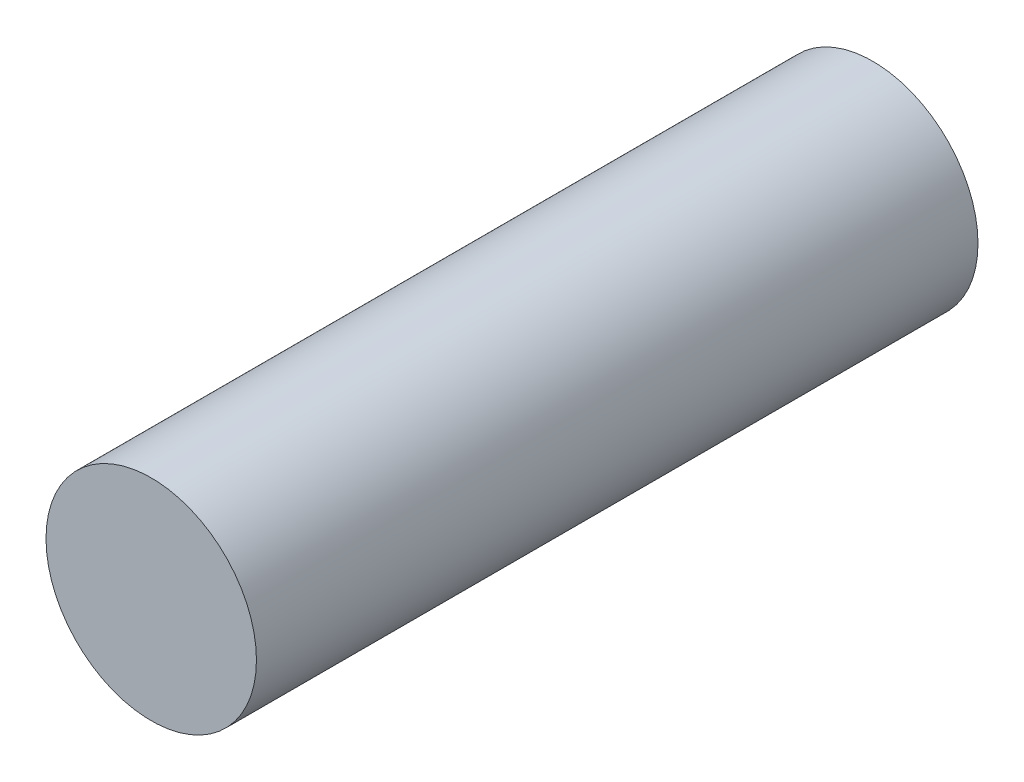
ISO-10303-21;
HEADER;
FILE_DESCRIPTION(('STEP AP214'),'2;1');
FILE_NAME('part.step','',(''),(''),'','','');
FILE_SCHEMA(('AUTOMOTIVE_DESIGN { 1 0 10303 214 1 1 1 1 }'));
ENDSEC;
DATA;
#1=APPLICATION_CONTEXT('core data for automotive mechanical design processes');
#2=APPLICATION_PROTOCOL_DEFINITION('international standard','automotive_design',2000,#1);
#3=PRODUCT_CONTEXT('',#1,'mechanical');
#4=PRODUCT('Part','Part','',(#3));
#5=PRODUCT_RELATED_PRODUCT_CATEGORY('part','',(#4));
#6=PRODUCT_DEFINITION_FORMATION('','',#4);
#7=PRODUCT_DEFINITION_CONTEXT('part definition',#1,'design');
#8=PRODUCT_DEFINITION('design','',#6,#7);
#9=PRODUCT_DEFINITION_SHAPE('','',#8);
#10=(LENGTH_UNIT() NAMED_UNIT(*) SI_UNIT(.MILLI.,.METRE.));
#11=(NAMED_UNIT(*) PLANE_ANGLE_UNIT() SI_UNIT($,.RADIAN.));
#12=(NAMED_UNIT(*) SI_UNIT($,.STERADIAN.) SOLID_ANGLE_UNIT());
#13=UNCERTAINTY_MEASURE_WITH_UNIT(LENGTH_MEASURE(1.E-05),#10,'distance_accuracy_value','');
#14=(GEOMETRIC_REPRESENTATION_CONTEXT(3) GLOBAL_UNCERTAINTY_ASSIGNED_CONTEXT((#13)) GLOBAL_UNIT_ASSIGNED_CONTEXT((#10,
#11,#12)) REPRESENTATION_CONTEXT('',''));
#15=CARTESIAN_POINT('',(0.,0.,0.));
#16=DIRECTION('',(0.,0.,1.));
#17=DIRECTION('',(1.,0.,0.));
#18=AXIS2_PLACEMENT_3D('',#15,#16,#17);
#19=CARTESIAN_POINT('',(0.,0.,120.));
#20=DIRECTION('',(0.,0.,-1.));
#21=DIRECTION('',(-1.,0.,0.));
#22=AXIS2_PLACEMENT_3D('',#19,#20,#21);
#23=CYLINDRICAL_SURFACE('',#22,17.5);
#24=CARTESIAN_POINT('',(0.,0.,120.));
#25=DIRECTION('',(0.,0.,1.));
#26=DIRECTION('',(1.,0.,0.));
#27=AXIS2_PLACEMENT_3D('',#24,#25,#26);
#28=CIRCLE('',#27,17.5);
#29=CARTESIAN_POINT('',(17.5,0.,120.));
#30=VERTEX_POINT('',#29);
#31=EDGE_CURVE('E10',#30,#30,#28,.T.);
#32=ORIENTED_EDGE('',*,*,#31,.F.);
#33=EDGE_LOOP('',(#32));
#34=FACE_BOUND('',#33,.T.);
#35=CARTESIAN_POINT('',(0.,0.,0.));
#36=DIRECTION('',(0.,0.,1.));
#37=DIRECTION('',(1.,0.,0.));
#38=AXIS2_PLACEMENT_3D('',#35,#36,#37);
#39=CIRCLE('',#38,17.5);
#40=CARTESIAN_POINT('',(17.5,0.,0.));
#41=VERTEX_POINT('',#40);
#42=EDGE_CURVE('E40',#41,#41,#39,.T.);
#43=ORIENTED_EDGE('',*,*,#42,.T.);
#44=EDGE_LOOP('',(#43));
#45=FACE_BOUND('',#44,.T.);
#46=ADVANCED_FACE('F37',(#34,#45),#23,.T.);
#47=CARTESIAN_POINT('',(0.,0.,120.));
#48=DIRECTION('',(0.,0.,1.));
#49=DIRECTION('',(1.,0.,0.));
#50=AXIS2_PLACEMENT_3D('',#47,#48,#49);
#51=PLANE('',#50);
#52=ORIENTED_EDGE('',*,*,#31,.T.);
#53=EDGE_LOOP('',(#52));
#54=FACE_BOUND('',#53,.T.);
#55=ADVANCED_FACE('F54',(#54),#51,.T.);
#56=CARTESIAN_POINT('',(0.,0.,0.));
#57=DIRECTION('',(0.,0.,1.));
#58=DIRECTION('',(1.,0.,0.));
#59=AXIS2_PLACEMENT_3D('',#56,#57,#58);
#60=PLANE('',#59);
#61=ORIENTED_EDGE('',*,*,#42,.F.);
#62=EDGE_LOOP('',(#61));
#63=FACE_BOUND('',#62,.T.);
#64=ADVANCED_FACE('F52',(#63),#60,.F.);
#65=CLOSED_SHELL('',(#46,#55,#64));
#66=MANIFOLD_SOLID_BREP('B2',#65);
#67=ADVANCED_BREP_SHAPE_REPRESENTATION('',(#18,#66),#14);
#68=SHAPE_DEFINITION_REPRESENTATION(#9,#67);
ENDSEC;
END-ISO-10303-21;
